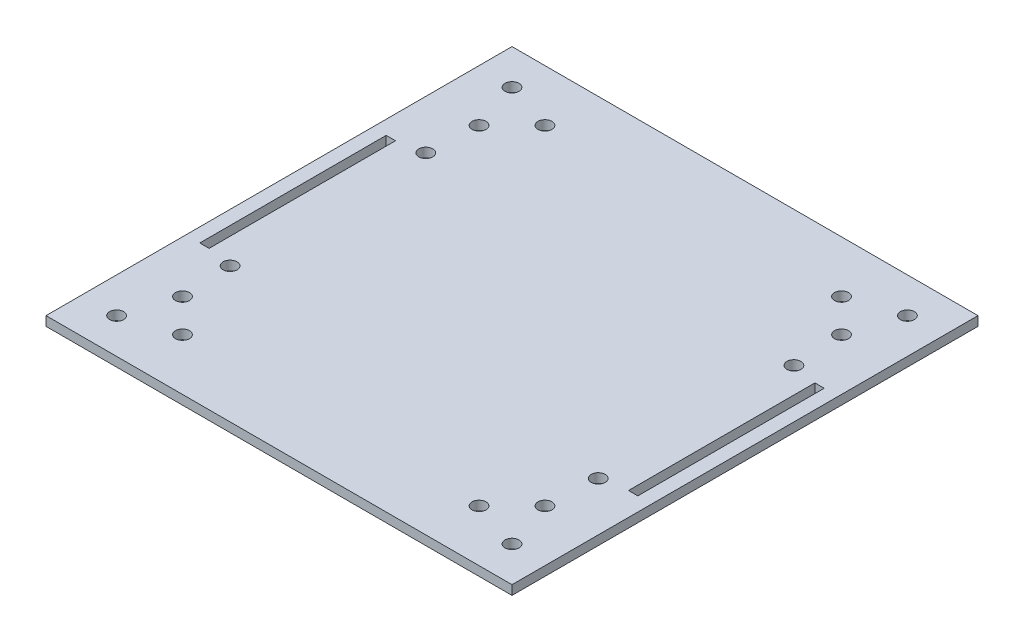
ISO-10303-21;
HEADER;
FILE_DESCRIPTION(('STEP AP214'),'2;1');
FILE_NAME('part.step','',(''),(''),'','','');
FILE_SCHEMA(('AUTOMOTIVE_DESIGN { 1 0 10303 214 1 1 1 1 }'));
ENDSEC;
DATA;
#1=APPLICATION_CONTEXT('core data for automotive mechanical design processes');
#2=APPLICATION_PROTOCOL_DEFINITION('international standard','automotive_design',2000,#1);
#3=PRODUCT_CONTEXT('',#1,'mechanical');
#4=PRODUCT('Part','Part','',(#3));
#5=PRODUCT_RELATED_PRODUCT_CATEGORY('part','',(#4));
#6=PRODUCT_DEFINITION_FORMATION('','',#4);
#7=PRODUCT_DEFINITION_CONTEXT('part definition',#1,'design');
#8=PRODUCT_DEFINITION('design','',#6,#7);
#9=PRODUCT_DEFINITION_SHAPE('','',#8);
#10=(LENGTH_UNIT() NAMED_UNIT(*) SI_UNIT(.MILLI.,.METRE.));
#11=(NAMED_UNIT(*) PLANE_ANGLE_UNIT() SI_UNIT($,.RADIAN.));
#12=(NAMED_UNIT(*) SI_UNIT($,.STERADIAN.) SOLID_ANGLE_UNIT());
#13=UNCERTAINTY_MEASURE_WITH_UNIT(LENGTH_MEASURE(1.E-05),#10,'distance_accuracy_value','');
#14=(GEOMETRIC_REPRESENTATION_CONTEXT(3) GLOBAL_UNCERTAINTY_ASSIGNED_CONTEXT((#13)) GLOBAL_UNIT_ASSIGNED_CONTEXT((#10,
#11,#12)) REPRESENTATION_CONTEXT('',''));
#15=CARTESIAN_POINT('',(0.,0.,0.));
#16=DIRECTION('',(0.,0.,1.));
#17=DIRECTION('',(1.,0.,0.));
#18=AXIS2_PLACEMENT_3D('',#15,#16,#17);
#19=CARTESIAN_POINT('',(50.,2.,50.));
#20=DIRECTION('',(-1.,0.,0.));
#21=DIRECTION('',(0.,0.,1.));
#22=AXIS2_PLACEMENT_3D('',#19,#20,#21);
#23=PLANE('',#22);
#24=DIRECTION('',(0.,0.,-1.));
#25=VECTOR('',#24,1.);
#26=CARTESIAN_POINT('',(50.,0.,50.));
#27=LINE('',#26,#25);
#28=CARTESIAN_POINT('',(50.,0.,50.));
#29=VERTEX_POINT('',#28);
#30=CARTESIAN_POINT('',(50.,0.,-50.));
#31=VERTEX_POINT('',#30);
#32=EDGE_CURVE('E290',#29,#31,#27,.T.);
#33=ORIENTED_EDGE('',*,*,#32,.T.);
#34=DIRECTION('',(0.,-1.,0.));
#35=VECTOR('',#34,1.);
#36=CARTESIAN_POINT('',(50.,2.,-50.));
#37=LINE('',#36,#35);
#38=CARTESIAN_POINT('',(50.,2.,-50.));
#39=VERTEX_POINT('',#38);
#40=EDGE_CURVE('E11',#39,#31,#37,.T.);
#41=ORIENTED_EDGE('',*,*,#40,.F.);
#42=DIRECTION('',(0.,0.,-1.));
#43=VECTOR('',#42,1.);
#44=CARTESIAN_POINT('',(50.,2.,50.));
#45=LINE('',#44,#43);
#46=CARTESIAN_POINT('',(50.,2.,50.));
#47=VERTEX_POINT('',#46);
#48=EDGE_CURVE('E293',#47,#39,#45,.T.);
#49=ORIENTED_EDGE('',*,*,#48,.F.);
#50=DIRECTION('',(0.,-1.,0.));
#51=VECTOR('',#50,1.);
#52=CARTESIAN_POINT('',(50.,2.,50.));
#53=LINE('',#52,#51);
#54=EDGE_CURVE('E303',#47,#29,#53,.T.);
#55=ORIENTED_EDGE('',*,*,#54,.T.);
#56=EDGE_LOOP('',(#33,#41,#49,#55));
#57=FACE_BOUND('',#56,.T.);
#58=ADVANCED_FACE('F38',(#57),#23,.F.);
#59=CARTESIAN_POINT('',(-50.,2.,-50.));
#60=DIRECTION('',(0.,0.,1.));
#61=DIRECTION('',(1.,0.,0.));
#62=AXIS2_PLACEMENT_3D('',#59,#60,#61);
#63=PLANE('',#62);
#64=DIRECTION('',(-1.,0.,0.));
#65=VECTOR('',#64,1.);
#66=CARTESIAN_POINT('',(-50.,0.,-50.));
#67=LINE('',#66,#65);
#68=CARTESIAN_POINT('',(-50.,0.,-50.));
#69=VERTEX_POINT('',#68);
#70=EDGE_CURVE('E306',#31,#69,#67,.T.);
#71=ORIENTED_EDGE('',*,*,#70,.T.);
#72=DIRECTION('',(0.,-1.,0.));
#73=VECTOR('',#72,1.);
#74=CARTESIAN_POINT('',(-50.,2.,-50.));
#75=LINE('',#74,#73);
#76=CARTESIAN_POINT('',(-50.,2.,-50.));
#77=VERTEX_POINT('',#76);
#78=EDGE_CURVE('E45',#77,#69,#75,.T.);
#79=ORIENTED_EDGE('',*,*,#78,.F.);
#80=DIRECTION('',(-1.,0.,0.));
#81=VECTOR('',#80,1.);
#82=CARTESIAN_POINT('',(-50.,2.,-50.));
#83=LINE('',#82,#81);
#84=EDGE_CURVE('E296',#39,#77,#83,.T.);
#85=ORIENTED_EDGE('',*,*,#84,.F.);
#86=ORIENTED_EDGE('',*,*,#40,.T.);
#87=EDGE_LOOP('',(#71,#79,#85,#86));
#88=FACE_BOUND('',#87,.T.);
#89=ADVANCED_FACE('F335',(#88),#63,.F.);
#90=CARTESIAN_POINT('',(-50.,2.,50.));
#91=DIRECTION('',(1.,0.,0.));
#92=DIRECTION('',(0.,0.,-1.));
#93=AXIS2_PLACEMENT_3D('',#90,#91,#92);
#94=PLANE('',#93);
#95=DIRECTION('',(0.,0.,1.));
#96=VECTOR('',#95,1.);
#97=CARTESIAN_POINT('',(-50.,0.,50.));
#98=LINE('',#97,#96);
#99=CARTESIAN_POINT('',(-50.,0.,50.));
#100=VERTEX_POINT('',#99);
#101=EDGE_CURVE('E308',#69,#100,#98,.T.);
#102=ORIENTED_EDGE('',*,*,#101,.T.);
#103=DIRECTION('',(0.,-1.,0.));
#104=VECTOR('',#103,1.);
#105=CARTESIAN_POINT('',(-50.,2.,50.));
#106=LINE('',#105,#104);
#107=CARTESIAN_POINT('',(-50.,2.,50.));
#108=VERTEX_POINT('',#107);
#109=EDGE_CURVE('E313',#108,#100,#106,.T.);
#110=ORIENTED_EDGE('',*,*,#109,.F.);
#111=DIRECTION('',(0.,0.,1.));
#112=VECTOR('',#111,1.);
#113=CARTESIAN_POINT('',(-50.,2.,50.));
#114=LINE('',#113,#112);
#115=EDGE_CURVE('E299',#77,#108,#114,.T.);
#116=ORIENTED_EDGE('',*,*,#115,.F.);
#117=ORIENTED_EDGE('',*,*,#78,.T.);
#118=EDGE_LOOP('',(#102,#110,#116,#117));
#119=FACE_BOUND('',#118,.T.);
#120=ADVANCED_FACE('F320',(#119),#94,.F.);
#121=CARTESIAN_POINT('',(-50.,2.,50.));
#122=DIRECTION('',(0.,0.,-1.));
#123=DIRECTION('',(-1.,0.,0.));
#124=AXIS2_PLACEMENT_3D('',#121,#122,#123);
#125=PLANE('',#124);
#126=DIRECTION('',(1.,0.,0.));
#127=VECTOR('',#126,1.);
#128=CARTESIAN_POINT('',(-50.,0.,50.));
#129=LINE('',#128,#127);
#130=EDGE_CURVE('E297',#100,#29,#129,.T.);
#131=ORIENTED_EDGE('',*,*,#130,.T.);
#132=ORIENTED_EDGE('',*,*,#54,.F.);
#133=DIRECTION('',(1.,0.,0.));
#134=VECTOR('',#133,1.);
#135=CARTESIAN_POINT('',(-50.,2.,50.));
#136=LINE('',#135,#134);
#137=EDGE_CURVE('E301',#108,#47,#136,.T.);
#138=ORIENTED_EDGE('',*,*,#137,.F.);
#139=ORIENTED_EDGE('',*,*,#109,.T.);
#140=EDGE_LOOP('',(#131,#132,#138,#139));
#141=FACE_BOUND('',#140,.T.);
#142=ADVANCED_FACE('F329',(#141),#125,.F.);
#143=CARTESIAN_POINT('',(0.,2.,0.));
#144=DIRECTION('',(0.,-1.,0.));
#145=DIRECTION('',(0.,0.,-1.));
#146=AXIS2_PLACEMENT_3D('',#143,#144,#145);
#147=PLANE('',#146);
#148=DIRECTION('',(1.,0.,0.));
#149=VECTOR('',#148,1.);
#150=CARTESIAN_POINT('',(-47.,2.,-20.));
#151=LINE('',#150,#149);
#152=CARTESIAN_POINT('',(-47.,2.,-20.));
#153=VERTEX_POINT('',#152);
#154=CARTESIAN_POINT('',(-45.,2.,-20.));
#155=VERTEX_POINT('',#154);
#156=EDGE_CURVE('E138',#153,#155,#151,.T.);
#157=ORIENTED_EDGE('',*,*,#156,.T.);
#158=DIRECTION('',(0.,0.,1.));
#159=VECTOR('',#158,1.);
#160=CARTESIAN_POINT('',(-45.,2.,-20.));
#161=LINE('',#160,#159);
#162=CARTESIAN_POINT('',(-45.,2.,20.));
#163=VERTEX_POINT('',#162);
#164=EDGE_CURVE('E130',#155,#163,#161,.T.);
#165=ORIENTED_EDGE('',*,*,#164,.T.);
#166=DIRECTION('',(-1.,0.,0.));
#167=VECTOR('',#166,1.);
#168=CARTESIAN_POINT('',(-47.,2.,20.));
#169=LINE('',#168,#167);
#170=CARTESIAN_POINT('',(-47.,2.,20.));
#171=VERTEX_POINT('',#170);
#172=EDGE_CURVE('E141',#163,#171,#169,.T.);
#173=ORIENTED_EDGE('',*,*,#172,.T.);
#174=DIRECTION('',(0.,0.,-1.));
#175=VECTOR('',#174,1.);
#176=CARTESIAN_POINT('',(-47.,2.,-20.));
#177=LINE('',#176,#175);
#178=EDGE_CURVE('E52',#171,#153,#177,.T.);
#179=ORIENTED_EDGE('',*,*,#178,.T.);
#180=EDGE_LOOP('',(#157,#165,#173,#179));
#181=FACE_BOUND('',#180,.T.);
#182=DIRECTION('',(1.,0.,0.));
#183=VECTOR('',#182,1.);
#184=CARTESIAN_POINT('',(47.,2.,-20.));
#185=LINE('',#184,#183);
#186=CARTESIAN_POINT('',(45.,2.,-20.));
#187=VERTEX_POINT('',#186);
#188=CARTESIAN_POINT('',(47.,2.,-20.));
#189=VERTEX_POINT('',#188);
#190=EDGE_CURVE('E176',#187,#189,#185,.T.);
#191=ORIENTED_EDGE('',*,*,#190,.T.);
#192=DIRECTION('',(0.,0.,1.));
#193=VECTOR('',#192,1.);
#194=CARTESIAN_POINT('',(47.,2.,-20.));
#195=LINE('',#194,#193);
#196=CARTESIAN_POINT('',(47.,2.,20.));
#197=VERTEX_POINT('',#196);
#198=EDGE_CURVE('E168',#189,#197,#195,.T.);
#199=ORIENTED_EDGE('',*,*,#198,.T.);
#200=DIRECTION('',(-1.,0.,0.));
#201=VECTOR('',#200,1.);
#202=CARTESIAN_POINT('',(47.,2.,20.));
#203=LINE('',#202,#201);
#204=CARTESIAN_POINT('',(45.,2.,20.));
#205=VERTEX_POINT('',#204);
#206=EDGE_CURVE('E171',#197,#205,#203,.T.);
#207=ORIENTED_EDGE('',*,*,#206,.T.);
#208=DIRECTION('',(0.,0.,-1.));
#209=VECTOR('',#208,1.);
#210=CARTESIAN_POINT('',(45.,2.,-20.));
#211=LINE('',#210,#209);
#212=EDGE_CURVE('E60',#205,#187,#211,.T.);
#213=ORIENTED_EDGE('',*,*,#212,.T.);
#214=EDGE_LOOP('',(#191,#199,#207,#213));
#215=FACE_BOUND('',#214,.T.);
#216=CARTESIAN_POINT('',(-39.5,2.,-21.));
#217=DIRECTION('',(0.,-1.,0.));
#218=DIRECTION('',(0.,0.,1.));
#219=AXIS2_PLACEMENT_3D('',#216,#217,#218);
#220=CIRCLE('',#219,1.5);
#221=CARTESIAN_POINT('',(-39.5,2.,-19.5));
#222=VERTEX_POINT('',#221);
#223=EDGE_CURVE('E210',#222,#222,#220,.T.);
#224=ORIENTED_EDGE('',*,*,#223,.T.);
#225=EDGE_LOOP('',(#224));
#226=FACE_BOUND('',#225,.T.);
#227=CARTESIAN_POINT('',(39.5,2.,-21.));
#228=DIRECTION('',(0.,-1.,0.));
#229=DIRECTION('',(0.,0.,-1.));
#230=AXIS2_PLACEMENT_3D('',#227,#228,#229);
#231=CIRCLE('',#230,1.5);
#232=CARTESIAN_POINT('',(39.5,2.,-22.5));
#233=VERTEX_POINT('',#232);
#234=EDGE_CURVE('E204',#233,#233,#231,.T.);
#235=ORIENTED_EDGE('',*,*,#234,.T.);
#236=EDGE_LOOP('',(#235));
#237=FACE_BOUND('',#236,.T.);
#238=CARTESIAN_POINT('',(39.5,2.,21.));
#239=DIRECTION('',(0.,-1.,0.));
#240=DIRECTION('',(0.,0.,1.));
#241=AXIS2_PLACEMENT_3D('',#238,#239,#240);
#242=CIRCLE('',#241,1.5);
#243=CARTESIAN_POINT('',(39.5,2.,22.5));
#244=VERTEX_POINT('',#243);
#245=EDGE_CURVE('E197',#244,#244,#242,.T.);
#246=ORIENTED_EDGE('',*,*,#245,.T.);
#247=EDGE_LOOP('',(#246));
#248=FACE_BOUND('',#247,.T.);
#249=CARTESIAN_POINT('',(-39.5,2.,21.));
#250=DIRECTION('',(0.,-1.,0.));
#251=DIRECTION('',(0.,0.,-1.));
#252=AXIS2_PLACEMENT_3D('',#249,#250,#251);
#253=CIRCLE('',#252,1.5);
#254=CARTESIAN_POINT('',(-39.5,2.,19.5));
#255=VERTEX_POINT('',#254);
#256=EDGE_CURVE('E215',#255,#255,#253,.T.);
#257=ORIENTED_EDGE('',*,*,#256,.T.);
#258=EDGE_LOOP('',(#257));
#259=FACE_BOUND('',#258,.T.);
#260=CARTESIAN_POINT('',(42.4264068711928,2.,-42.4264068711929));
#261=DIRECTION('',(0.,1.,0.));
#262=DIRECTION('',(0.,0.,-1.));
#263=AXIS2_PLACEMENT_3D('',#260,#261,#262);
#264=CIRCLE('',#263,1.5);
#265=CARTESIAN_POINT('',(42.4264068711928,2.,-43.9264068711929));
#266=VERTEX_POINT('',#265);
#267=EDGE_CURVE('E224',#266,#266,#264,.T.);
#268=ORIENTED_EDGE('',*,*,#267,.F.);
#269=EDGE_LOOP('',(#268));
#270=FACE_BOUND('',#269,.T.);
#271=CARTESIAN_POINT('',(38.89087296526,2.,-31.8198051533947));
#272=DIRECTION('',(0.,1.,0.));
#273=DIRECTION('',(0.,0.,-1.));
#274=AXIS2_PLACEMENT_3D('',#271,#272,#273);
#275=CIRCLE('',#274,1.5);
#276=CARTESIAN_POINT('',(38.89087296526,2.,-33.3198051533947));
#277=VERTEX_POINT('',#276);
#278=EDGE_CURVE('E255',#277,#277,#275,.T.);
#279=ORIENTED_EDGE('',*,*,#278,.F.);
#280=EDGE_LOOP('',(#279));
#281=FACE_BOUND('',#280,.T.);
#282=CARTESIAN_POINT('',(31.8198051533946,2.,-38.8908729652602));
#283=DIRECTION('',(0.,1.,0.));
#284=DIRECTION('',(0.,0.,-1.));
#285=AXIS2_PLACEMENT_3D('',#282,#283,#284);
#286=CIRCLE('',#285,1.5);
#287=CARTESIAN_POINT('',(31.8198051533946,2.,-40.3908729652602));
#288=VERTEX_POINT('',#287);
#289=EDGE_CURVE('E249',#288,#288,#286,.T.);
#290=ORIENTED_EDGE('',*,*,#289,.F.);
#291=EDGE_LOOP('',(#290));
#292=FACE_BOUND('',#291,.T.);
#293=CARTESIAN_POINT('',(-42.4264068711928,2.,42.4264068711929));
#294=DIRECTION('',(0.,1.,0.));
#295=DIRECTION('',(0.,0.,-1.));
#296=AXIS2_PLACEMENT_3D('',#293,#294,#295);
#297=CIRCLE('',#296,1.5);
#298=CARTESIAN_POINT('',(-42.4264068711928,2.,40.9264068711929));
#299=VERTEX_POINT('',#298);
#300=EDGE_CURVE('E243',#299,#299,#297,.T.);
#301=ORIENTED_EDGE('',*,*,#300,.F.);
#302=EDGE_LOOP('',(#301));
#303=FACE_BOUND('',#302,.T.);
#304=CARTESIAN_POINT('',(-38.89087296526,2.,31.8198051533947));
#305=DIRECTION('',(0.,1.,0.));
#306=DIRECTION('',(0.,0.,-1.));
#307=AXIS2_PLACEMENT_3D('',#304,#305,#306);
#308=CIRCLE('',#307,1.5);
#309=CARTESIAN_POINT('',(-38.89087296526,2.,30.3198051533947));
#310=VERTEX_POINT('',#309);
#311=EDGE_CURVE('E242',#310,#310,#308,.T.);
#312=ORIENTED_EDGE('',*,*,#311,.F.);
#313=EDGE_LOOP('',(#312));
#314=FACE_BOUND('',#313,.T.);
#315=CARTESIAN_POINT('',(-31.8198051533946,2.,38.8908729652602));
#316=DIRECTION('',(0.,1.,0.));
#317=DIRECTION('',(0.,0.,-1.));
#318=AXIS2_PLACEMENT_3D('',#315,#316,#317);
#319=CIRCLE('',#318,1.5);
#320=CARTESIAN_POINT('',(-31.8198051533946,2.,37.3908729652602));
#321=VERTEX_POINT('',#320);
#322=EDGE_CURVE('E279',#321,#321,#319,.T.);
#323=ORIENTED_EDGE('',*,*,#322,.F.);
#324=EDGE_LOOP('',(#323));
#325=FACE_BOUND('',#324,.T.);
#326=CARTESIAN_POINT('',(-38.89087296526,2.,-31.8198051533947));
#327=DIRECTION('',(0.,1.,0.));
#328=DIRECTION('',(0.,0.,1.));
#329=AXIS2_PLACEMENT_3D('',#326,#327,#328);
#330=CIRCLE('',#329,1.5);
#331=CARTESIAN_POINT('',(-38.89087296526,2.,-30.3198051533947));
#332=VERTEX_POINT('',#331);
#333=EDGE_CURVE('E273',#332,#332,#330,.T.);
#334=ORIENTED_EDGE('',*,*,#333,.F.);
#335=EDGE_LOOP('',(#334));
#336=FACE_BOUND('',#335,.T.);
#337=CARTESIAN_POINT('',(-31.8198051533946,2.,-38.8908729652602));
#338=DIRECTION('',(0.,1.,0.));
#339=DIRECTION('',(0.,0.,1.));
#340=AXIS2_PLACEMENT_3D('',#337,#338,#339);
#341=CIRCLE('',#340,1.5);
#342=CARTESIAN_POINT('',(-31.8198051533946,2.,-37.3908729652602));
#343=VERTEX_POINT('',#342);
#344=EDGE_CURVE('E267',#343,#343,#341,.T.);
#345=ORIENTED_EDGE('',*,*,#344,.F.);
#346=EDGE_LOOP('',(#345));
#347=FACE_BOUND('',#346,.T.);
#348=CARTESIAN_POINT('',(31.8198051533946,2.,38.8908729652602));
#349=DIRECTION('',(0.,1.,0.));
#350=DIRECTION('',(0.,0.,1.));
#351=AXIS2_PLACEMENT_3D('',#348,#349,#350);
#352=CIRCLE('',#351,1.5);
#353=CARTESIAN_POINT('',(31.8198051533946,2.,40.3908729652602));
#354=VERTEX_POINT('',#353);
#355=EDGE_CURVE('E225',#354,#354,#352,.T.);
#356=ORIENTED_EDGE('',*,*,#355,.F.);
#357=EDGE_LOOP('',(#356));
#358=FACE_BOUND('',#357,.T.);
#359=CARTESIAN_POINT('',(42.4264068711928,2.,42.4264068711929));
#360=DIRECTION('',(0.,1.,0.));
#361=DIRECTION('',(0.,0.,1.));
#362=AXIS2_PLACEMENT_3D('',#359,#360,#361);
#363=CIRCLE('',#362,1.49999999999998);
#364=CARTESIAN_POINT('',(42.4264068711928,2.,43.9264068711929));
#365=VERTEX_POINT('',#364);
#366=EDGE_CURVE('E231',#365,#365,#363,.T.);
#367=ORIENTED_EDGE('',*,*,#366,.F.);
#368=EDGE_LOOP('',(#367));
#369=FACE_BOUND('',#368,.T.);
#370=CARTESIAN_POINT('',(38.89087296526,2.,31.8198051533947));
#371=DIRECTION('',(0.,1.,0.));
#372=DIRECTION('',(0.,0.,1.));
#373=AXIS2_PLACEMENT_3D('',#370,#371,#372);
#374=CIRCLE('',#373,1.5);
#375=CARTESIAN_POINT('',(38.89087296526,2.,33.3198051533947));
#376=VERTEX_POINT('',#375);
#377=EDGE_CURVE('E218',#376,#376,#374,.T.);
#378=ORIENTED_EDGE('',*,*,#377,.F.);
#379=EDGE_LOOP('',(#378));
#380=FACE_BOUND('',#379,.T.);
#381=CARTESIAN_POINT('',(-42.4264068711928,2.,-42.4264068711929));
#382=DIRECTION('',(0.,1.,0.));
#383=DIRECTION('',(0.,0.,1.));
#384=AXIS2_PLACEMENT_3D('',#381,#382,#383);
#385=CIRCLE('',#384,1.5);
#386=CARTESIAN_POINT('',(-42.4264068711928,2.,-40.9264068711929));
#387=VERTEX_POINT('',#386);
#388=EDGE_CURVE('E266',#387,#387,#385,.T.);
#389=ORIENTED_EDGE('',*,*,#388,.F.);
#390=EDGE_LOOP('',(#389));
#391=FACE_BOUND('',#390,.T.);
#392=ORIENTED_EDGE('',*,*,#48,.T.);
#393=ORIENTED_EDGE('',*,*,#84,.T.);
#394=ORIENTED_EDGE('',*,*,#115,.T.);
#395=ORIENTED_EDGE('',*,*,#137,.T.);
#396=EDGE_LOOP('',(#392,#393,#394,#395));
#397=FACE_BOUND('',#396,.T.);
#398=ADVANCED_FACE('F145',(#181,#215,#226,#237,#248,#259,#270,#281,#292,#303,#314,#325,#336,
#347,#358,#369,#380,#391,#397),#147,.F.);
#399=CARTESIAN_POINT('',(0.,0.,0.));
#400=DIRECTION('',(0.,-1.,0.));
#401=DIRECTION('',(0.,0.,-1.));
#402=AXIS2_PLACEMENT_3D('',#399,#400,#401);
#403=PLANE('',#402);
#404=DIRECTION('',(0.,0.,1.));
#405=VECTOR('',#404,1.);
#406=CARTESIAN_POINT('',(-45.,0.,-20.));
#407=LINE('',#406,#405);
#408=CARTESIAN_POINT('',(-45.,0.,-20.));
#409=VERTEX_POINT('',#408);
#410=CARTESIAN_POINT('',(-45.,0.,20.));
#411=VERTEX_POINT('',#410);
#412=EDGE_CURVE('E133',#409,#411,#407,.T.);
#413=ORIENTED_EDGE('',*,*,#412,.F.);
#414=DIRECTION('',(1.,0.,0.));
#415=VECTOR('',#414,1.);
#416=CARTESIAN_POINT('',(-47.,0.,-20.));
#417=LINE('',#416,#415);
#418=CARTESIAN_POINT('',(-47.,0.,-20.));
#419=VERTEX_POINT('',#418);
#420=EDGE_CURVE('E148',#419,#409,#417,.T.);
#421=ORIENTED_EDGE('',*,*,#420,.F.);
#422=DIRECTION('',(0.,0.,-1.));
#423=VECTOR('',#422,1.);
#424=CARTESIAN_POINT('',(-47.,0.,-20.));
#425=LINE('',#424,#423);
#426=CARTESIAN_POINT('',(-47.,0.,20.));
#427=VERTEX_POINT('',#426);
#428=EDGE_CURVE('E151',#427,#419,#425,.T.);
#429=ORIENTED_EDGE('',*,*,#428,.F.);
#430=DIRECTION('',(-1.,0.,0.));
#431=VECTOR('',#430,1.);
#432=CARTESIAN_POINT('',(-47.,0.,20.));
#433=LINE('',#432,#431);
#434=EDGE_CURVE('E157',#411,#427,#433,.T.);
#435=ORIENTED_EDGE('',*,*,#434,.F.);
#436=EDGE_LOOP('',(#413,#421,#429,#435));
#437=FACE_BOUND('',#436,.T.);
#438=DIRECTION('',(0.,0.,1.));
#439=VECTOR('',#438,1.);
#440=CARTESIAN_POINT('',(47.,0.,-20.));
#441=LINE('',#440,#439);
#442=CARTESIAN_POINT('',(47.,0.,-20.));
#443=VERTEX_POINT('',#442);
#444=CARTESIAN_POINT('',(47.,0.,20.));
#445=VERTEX_POINT('',#444);
#446=EDGE_CURVE('E180',#443,#445,#441,.T.);
#447=ORIENTED_EDGE('',*,*,#446,.F.);
#448=DIRECTION('',(1.,0.,0.));
#449=VECTOR('',#448,1.);
#450=CARTESIAN_POINT('',(47.,0.,-20.));
#451=LINE('',#450,#449);
#452=CARTESIAN_POINT('',(45.,0.,-20.));
#453=VERTEX_POINT('',#452);
#454=EDGE_CURVE('E172',#453,#443,#451,.T.);
#455=ORIENTED_EDGE('',*,*,#454,.F.);
#456=DIRECTION('',(0.,0.,-1.));
#457=VECTOR('',#456,1.);
#458=CARTESIAN_POINT('',(45.,0.,-20.));
#459=LINE('',#458,#457);
#460=CARTESIAN_POINT('',(45.,0.,20.));
#461=VERTEX_POINT('',#460);
#462=EDGE_CURVE('E185',#461,#453,#459,.T.);
#463=ORIENTED_EDGE('',*,*,#462,.F.);
#464=DIRECTION('',(-1.,0.,0.));
#465=VECTOR('',#464,1.);
#466=CARTESIAN_POINT('',(47.,0.,20.));
#467=LINE('',#466,#465);
#468=EDGE_CURVE('E182',#445,#461,#467,.T.);
#469=ORIENTED_EDGE('',*,*,#468,.F.);
#470=EDGE_LOOP('',(#447,#455,#463,#469));
#471=FACE_BOUND('',#470,.T.);
#472=CARTESIAN_POINT('',(-39.5,0.,-21.));
#473=DIRECTION('',(0.,-1.,0.));
#474=DIRECTION('',(0.,0.,1.));
#475=AXIS2_PLACEMENT_3D('',#472,#473,#474);
#476=CIRCLE('',#475,1.5);
#477=CARTESIAN_POINT('',(-39.5,0.,-19.5));
#478=VERTEX_POINT('',#477);
#479=EDGE_CURVE('E164',#478,#478,#476,.T.);
#480=ORIENTED_EDGE('',*,*,#479,.F.);
#481=EDGE_LOOP('',(#480));
#482=FACE_BOUND('',#481,.T.);
#483=CARTESIAN_POINT('',(39.5,0.,-21.));
#484=DIRECTION('',(0.,-1.,0.));
#485=DIRECTION('',(0.,0.,-1.));
#486=AXIS2_PLACEMENT_3D('',#483,#484,#485);
#487=CIRCLE('',#486,1.5);
#488=CARTESIAN_POINT('',(39.5,0.,-22.5));
#489=VERTEX_POINT('',#488);
#490=EDGE_CURVE('E207',#489,#489,#487,.T.);
#491=ORIENTED_EDGE('',*,*,#490,.F.);
#492=EDGE_LOOP('',(#491));
#493=FACE_BOUND('',#492,.T.);
#494=CARTESIAN_POINT('',(39.5,0.,21.));
#495=DIRECTION('',(0.,-1.,0.));
#496=DIRECTION('',(0.,0.,1.));
#497=AXIS2_PLACEMENT_3D('',#494,#495,#496);
#498=CIRCLE('',#497,1.5);
#499=CARTESIAN_POINT('',(39.5,0.,22.5));
#500=VERTEX_POINT('',#499);
#501=EDGE_CURVE('E201',#500,#500,#498,.T.);
#502=ORIENTED_EDGE('',*,*,#501,.F.);
#503=EDGE_LOOP('',(#502));
#504=FACE_BOUND('',#503,.T.);
#505=CARTESIAN_POINT('',(-39.5,0.,21.));
#506=DIRECTION('',(0.,-1.,0.));
#507=DIRECTION('',(0.,0.,-1.));
#508=AXIS2_PLACEMENT_3D('',#505,#506,#507);
#509=CIRCLE('',#508,1.5);
#510=CARTESIAN_POINT('',(-39.5,0.,19.5));
#511=VERTEX_POINT('',#510);
#512=EDGE_CURVE('E200',#511,#511,#509,.T.);
#513=ORIENTED_EDGE('',*,*,#512,.F.);
#514=EDGE_LOOP('',(#513));
#515=FACE_BOUND('',#514,.T.);
#516=CARTESIAN_POINT('',(42.4264068711928,0.,-42.4264068711929));
#517=DIRECTION('',(0.,1.,0.));
#518=DIRECTION('',(0.,0.,-1.));
#519=AXIS2_PLACEMENT_3D('',#516,#517,#518);
#520=CIRCLE('',#519,1.5);
#521=CARTESIAN_POINT('',(42.4264068711928,0.,-43.9264068711929));
#522=VERTEX_POINT('',#521);
#523=EDGE_CURVE('E258',#522,#522,#520,.T.);
#524=ORIENTED_EDGE('',*,*,#523,.T.);
#525=EDGE_LOOP('',(#524));
#526=FACE_BOUND('',#525,.T.);
#527=CARTESIAN_POINT('',(38.89087296526,0.,-31.8198051533947));
#528=DIRECTION('',(0.,1.,0.));
#529=DIRECTION('',(0.,0.,-1.));
#530=AXIS2_PLACEMENT_3D('',#527,#528,#529);
#531=CIRCLE('',#530,1.5);
#532=CARTESIAN_POINT('',(38.89087296526,0.,-33.3198051533947));
#533=VERTEX_POINT('',#532);
#534=EDGE_CURVE('E252',#533,#533,#531,.T.);
#535=ORIENTED_EDGE('',*,*,#534,.T.);
#536=EDGE_LOOP('',(#535));
#537=FACE_BOUND('',#536,.T.);
#538=CARTESIAN_POINT('',(31.8198051533946,0.,-38.8908729652602));
#539=DIRECTION('',(0.,1.,0.));
#540=DIRECTION('',(0.,0.,-1.));
#541=AXIS2_PLACEMENT_3D('',#538,#539,#540);
#542=CIRCLE('',#541,1.5);
#543=CARTESIAN_POINT('',(31.8198051533946,0.,-40.3908729652602));
#544=VERTEX_POINT('',#543);
#545=EDGE_CURVE('E246',#544,#544,#542,.T.);
#546=ORIENTED_EDGE('',*,*,#545,.T.);
#547=EDGE_LOOP('',(#546));
#548=FACE_BOUND('',#547,.T.);
#549=CARTESIAN_POINT('',(-42.4264068711928,0.,42.4264068711929));
#550=DIRECTION('',(0.,1.,0.));
#551=DIRECTION('',(0.,0.,-1.));
#552=AXIS2_PLACEMENT_3D('',#549,#550,#551);
#553=CIRCLE('',#552,1.5);
#554=CARTESIAN_POINT('',(-42.4264068711928,0.,40.9264068711929));
#555=VERTEX_POINT('',#554);
#556=EDGE_CURVE('E239',#555,#555,#553,.T.);
#557=ORIENTED_EDGE('',*,*,#556,.T.);
#558=EDGE_LOOP('',(#557));
#559=FACE_BOUND('',#558,.T.);
#560=CARTESIAN_POINT('',(-38.89087296526,0.,31.8198051533947));
#561=DIRECTION('',(0.,1.,0.));
#562=DIRECTION('',(0.,0.,-1.));
#563=AXIS2_PLACEMENT_3D('',#560,#561,#562);
#564=CIRCLE('',#563,1.5);
#565=CARTESIAN_POINT('',(-38.89087296526,0.,30.3198051533947));
#566=VERTEX_POINT('',#565);
#567=EDGE_CURVE('E282',#566,#566,#564,.T.);
#568=ORIENTED_EDGE('',*,*,#567,.T.);
#569=EDGE_LOOP('',(#568));
#570=FACE_BOUND('',#569,.T.);
#571=CARTESIAN_POINT('',(-31.8198051533946,0.,38.8908729652602));
#572=DIRECTION('',(0.,1.,0.));
#573=DIRECTION('',(0.,0.,-1.));
#574=AXIS2_PLACEMENT_3D('',#571,#572,#573);
#575=CIRCLE('',#574,1.5);
#576=CARTESIAN_POINT('',(-31.8198051533946,0.,37.3908729652602));
#577=VERTEX_POINT('',#576);
#578=EDGE_CURVE('E276',#577,#577,#575,.T.);
#579=ORIENTED_EDGE('',*,*,#578,.T.);
#580=EDGE_LOOP('',(#579));
#581=FACE_BOUND('',#580,.T.);
#582=CARTESIAN_POINT('',(-38.89087296526,0.,-31.8198051533947));
#583=DIRECTION('',(0.,1.,0.));
#584=DIRECTION('',(0.,0.,1.));
#585=AXIS2_PLACEMENT_3D('',#582,#583,#584);
#586=CIRCLE('',#585,1.5);
#587=CARTESIAN_POINT('',(-38.89087296526,0.,-30.3198051533947));
#588=VERTEX_POINT('',#587);
#589=EDGE_CURVE('E270',#588,#588,#586,.T.);
#590=ORIENTED_EDGE('',*,*,#589,.T.);
#591=EDGE_LOOP('',(#590));
#592=FACE_BOUND('',#591,.T.);
#593=CARTESIAN_POINT('',(-31.8198051533946,0.,-38.8908729652602));
#594=DIRECTION('',(0.,1.,0.));
#595=DIRECTION('',(0.,0.,1.));
#596=AXIS2_PLACEMENT_3D('',#593,#594,#595);
#597=CIRCLE('',#596,1.5);
#598=CARTESIAN_POINT('',(-31.8198051533946,0.,-37.3908729652602));
#599=VERTEX_POINT('',#598);
#600=EDGE_CURVE('E263',#599,#599,#597,.T.);
#601=ORIENTED_EDGE('',*,*,#600,.T.);
#602=EDGE_LOOP('',(#601));
#603=FACE_BOUND('',#602,.T.);
#604=CARTESIAN_POINT('',(31.8198051533946,0.,38.8908729652602));
#605=DIRECTION('',(0.,1.,0.));
#606=DIRECTION('',(0.,0.,1.));
#607=AXIS2_PLACEMENT_3D('',#604,#605,#606);
#608=CIRCLE('',#607,1.5);
#609=CARTESIAN_POINT('',(31.8198051533946,0.,40.3908729652602));
#610=VERTEX_POINT('',#609);
#611=EDGE_CURVE('E221',#610,#610,#608,.T.);
#612=ORIENTED_EDGE('',*,*,#611,.T.);
#613=EDGE_LOOP('',(#612));
#614=FACE_BOUND('',#613,.T.);
#615=CARTESIAN_POINT('',(42.4264068711928,0.,42.4264068711929));
#616=DIRECTION('',(0.,1.,0.));
#617=DIRECTION('',(0.,0.,1.));
#618=AXIS2_PLACEMENT_3D('',#615,#616,#617);
#619=CIRCLE('',#618,1.49999999999998);
#620=CARTESIAN_POINT('',(42.4264068711928,0.,43.9264068711929));
#621=VERTEX_POINT('',#620);
#622=EDGE_CURVE('E228',#621,#621,#619,.T.);
#623=ORIENTED_EDGE('',*,*,#622,.T.);
#624=EDGE_LOOP('',(#623));
#625=FACE_BOUND('',#624,.T.);
#626=CARTESIAN_POINT('',(38.89087296526,0.,31.8198051533947));
#627=DIRECTION('',(0.,1.,0.));
#628=DIRECTION('',(0.,0.,1.));
#629=AXIS2_PLACEMENT_3D('',#626,#627,#628);
#630=CIRCLE('',#629,1.5);
#631=CARTESIAN_POINT('',(38.89087296526,0.,33.3198051533947));
#632=VERTEX_POINT('',#631);
#633=EDGE_CURVE('E234',#632,#632,#630,.T.);
#634=ORIENTED_EDGE('',*,*,#633,.T.);
#635=EDGE_LOOP('',(#634));
#636=FACE_BOUND('',#635,.T.);
#637=CARTESIAN_POINT('',(-42.4264068711928,0.,-42.4264068711929));
#638=DIRECTION('',(0.,1.,0.));
#639=DIRECTION('',(0.,0.,1.));
#640=AXIS2_PLACEMENT_3D('',#637,#638,#639);
#641=CIRCLE('',#640,1.5);
#642=CARTESIAN_POINT('',(-42.4264068711928,0.,-40.9264068711929));
#643=VERTEX_POINT('',#642);
#644=EDGE_CURVE('E287',#643,#643,#641,.T.);
#645=ORIENTED_EDGE('',*,*,#644,.T.);
#646=EDGE_LOOP('',(#645));
#647=FACE_BOUND('',#646,.T.);
#648=ORIENTED_EDGE('',*,*,#32,.F.);
#649=ORIENTED_EDGE('',*,*,#130,.F.);
#650=ORIENTED_EDGE('',*,*,#101,.F.);
#651=ORIENTED_EDGE('',*,*,#70,.F.);
#652=EDGE_LOOP('',(#648,#649,#650,#651));
#653=FACE_BOUND('',#652,.T.);
#654=ADVANCED_FACE('F326',(#437,#471,#482,#493,#504,#515,#526,#537,#548,#559,#570,#581,#592,
#603,#614,#625,#636,#647,#653),#403,.T.);
#655=CARTESIAN_POINT('',(-42.4264068711928,0.,-42.4264068711929));
#656=DIRECTION('',(0.,1.,0.));
#657=DIRECTION('',(0.,0.,1.));
#658=AXIS2_PLACEMENT_3D('',#655,#656,#657);
#659=CYLINDRICAL_SURFACE('',#658,1.5);
#660=ORIENTED_EDGE('',*,*,#644,.F.);
#661=EDGE_LOOP('',(#660));
#662=FACE_BOUND('',#661,.T.);
#663=ORIENTED_EDGE('',*,*,#388,.T.);
#664=EDGE_LOOP('',(#663));
#665=FACE_BOUND('',#664,.T.);
#666=ADVANCED_FACE('F347',(#662,#665),#659,.F.);
#667=CARTESIAN_POINT('',(38.89087296526,0.,31.8198051533947));
#668=DIRECTION('',(0.,1.,0.));
#669=DIRECTION('',(0.,0.,1.));
#670=AXIS2_PLACEMENT_3D('',#667,#668,#669);
#671=CYLINDRICAL_SURFACE('',#670,1.5);
#672=ORIENTED_EDGE('',*,*,#633,.F.);
#673=EDGE_LOOP('',(#672));
#674=FACE_BOUND('',#673,.T.);
#675=ORIENTED_EDGE('',*,*,#377,.T.);
#676=EDGE_LOOP('',(#675));
#677=FACE_BOUND('',#676,.T.);
#678=ADVANCED_FACE('F353',(#674,#677),#671,.F.);
#679=CARTESIAN_POINT('',(42.4264068711928,0.,42.4264068711929));
#680=DIRECTION('',(0.,1.,0.));
#681=DIRECTION('',(0.,0.,1.));
#682=AXIS2_PLACEMENT_3D('',#679,#680,#681);
#683=CYLINDRICAL_SURFACE('',#682,1.49999999999998);
#684=ORIENTED_EDGE('',*,*,#622,.F.);
#685=EDGE_LOOP('',(#684));
#686=FACE_BOUND('',#685,.T.);
#687=ORIENTED_EDGE('',*,*,#366,.T.);
#688=EDGE_LOOP('',(#687));
#689=FACE_BOUND('',#688,.T.);
#690=ADVANCED_FACE('F391',(#686,#689),#683,.F.);
#691=CARTESIAN_POINT('',(31.8198051533946,0.,38.8908729652602));
#692=DIRECTION('',(0.,1.,0.));
#693=DIRECTION('',(0.,0.,1.));
#694=AXIS2_PLACEMENT_3D('',#691,#692,#693);
#695=CYLINDRICAL_SURFACE('',#694,1.5);
#696=ORIENTED_EDGE('',*,*,#611,.F.);
#697=EDGE_LOOP('',(#696));
#698=FACE_BOUND('',#697,.T.);
#699=ORIENTED_EDGE('',*,*,#355,.T.);
#700=EDGE_LOOP('',(#699));
#701=FACE_BOUND('',#700,.T.);
#702=ADVANCED_FACE('F371',(#698,#701),#695,.F.);
#703=CARTESIAN_POINT('',(-31.8198051533946,0.,-38.8908729652602));
#704=DIRECTION('',(0.,1.,0.));
#705=DIRECTION('',(0.,0.,1.));
#706=AXIS2_PLACEMENT_3D('',#703,#704,#705);
#707=CYLINDRICAL_SURFACE('',#706,1.5);
#708=ORIENTED_EDGE('',*,*,#600,.F.);
#709=EDGE_LOOP('',(#708));
#710=FACE_BOUND('',#709,.T.);
#711=ORIENTED_EDGE('',*,*,#344,.T.);
#712=EDGE_LOOP('',(#711));
#713=FACE_BOUND('',#712,.T.);
#714=ADVANCED_FACE('F367',(#710,#713),#707,.F.);
#715=CARTESIAN_POINT('',(-38.89087296526,0.,-31.8198051533947));
#716=DIRECTION('',(0.,1.,0.));
#717=DIRECTION('',(0.,0.,1.));
#718=AXIS2_PLACEMENT_3D('',#715,#716,#717);
#719=CYLINDRICAL_SURFACE('',#718,1.5);
#720=ORIENTED_EDGE('',*,*,#589,.F.);
#721=EDGE_LOOP('',(#720));
#722=FACE_BOUND('',#721,.T.);
#723=ORIENTED_EDGE('',*,*,#333,.T.);
#724=EDGE_LOOP('',(#723));
#725=FACE_BOUND('',#724,.T.);
#726=ADVANCED_FACE('F363',(#722,#725),#719,.F.);
#727=CARTESIAN_POINT('',(-31.8198051533946,0.,38.8908729652602));
#728=DIRECTION('',(0.,1.,0.));
#729=DIRECTION('',(0.,0.,1.));
#730=AXIS2_PLACEMENT_3D('',#727,#728,#729);
#731=CYLINDRICAL_SURFACE('',#730,1.5);
#732=ORIENTED_EDGE('',*,*,#578,.F.);
#733=EDGE_LOOP('',(#732));
#734=FACE_BOUND('',#733,.T.);
#735=ORIENTED_EDGE('',*,*,#322,.T.);
#736=EDGE_LOOP('',(#735));
#737=FACE_BOUND('',#736,.T.);
#738=ADVANCED_FACE('F359',(#734,#737),#731,.F.);
#739=CARTESIAN_POINT('',(-38.89087296526,0.,31.8198051533947));
#740=DIRECTION('',(0.,1.,0.));
#741=DIRECTION('',(0.,0.,1.));
#742=AXIS2_PLACEMENT_3D('',#739,#740,#741);
#743=CYLINDRICAL_SURFACE('',#742,1.5);
#744=ORIENTED_EDGE('',*,*,#567,.F.);
#745=EDGE_LOOP('',(#744));
#746=FACE_BOUND('',#745,.T.);
#747=ORIENTED_EDGE('',*,*,#311,.T.);
#748=EDGE_LOOP('',(#747));
#749=FACE_BOUND('',#748,.T.);
#750=ADVANCED_FACE('F355',(#746,#749),#743,.F.);
#751=CARTESIAN_POINT('',(-42.4264068711928,0.,42.4264068711929));
#752=DIRECTION('',(0.,1.,0.));
#753=DIRECTION('',(0.,0.,1.));
#754=AXIS2_PLACEMENT_3D('',#751,#752,#753);
#755=CYLINDRICAL_SURFACE('',#754,1.5);
#756=ORIENTED_EDGE('',*,*,#556,.F.);
#757=EDGE_LOOP('',(#756));
#758=FACE_BOUND('',#757,.T.);
#759=ORIENTED_EDGE('',*,*,#300,.T.);
#760=EDGE_LOOP('',(#759));
#761=FACE_BOUND('',#760,.T.);
#762=ADVANCED_FACE('F358',(#758,#761),#755,.F.);
#763=CARTESIAN_POINT('',(31.8198051533946,0.,-38.8908729652602));
#764=DIRECTION('',(0.,1.,0.));
#765=DIRECTION('',(0.,0.,1.));
#766=AXIS2_PLACEMENT_3D('',#763,#764,#765);
#767=CYLINDRICAL_SURFACE('',#766,1.5);
#768=ORIENTED_EDGE('',*,*,#545,.F.);
#769=EDGE_LOOP('',(#768));
#770=FACE_BOUND('',#769,.T.);
#771=ORIENTED_EDGE('',*,*,#289,.T.);
#772=EDGE_LOOP('',(#771));
#773=FACE_BOUND('',#772,.T.);
#774=ADVANCED_FACE('F381',(#770,#773),#767,.F.);
#775=CARTESIAN_POINT('',(38.89087296526,0.,-31.8198051533947));
#776=DIRECTION('',(0.,1.,0.));
#777=DIRECTION('',(0.,0.,1.));
#778=AXIS2_PLACEMENT_3D('',#775,#776,#777);
#779=CYLINDRICAL_SURFACE('',#778,1.5);
#780=ORIENTED_EDGE('',*,*,#534,.F.);
#781=EDGE_LOOP('',(#780));
#782=FACE_BOUND('',#781,.T.);
#783=ORIENTED_EDGE('',*,*,#278,.T.);
#784=EDGE_LOOP('',(#783));
#785=FACE_BOUND('',#784,.T.);
#786=ADVANCED_FACE('F377',(#782,#785),#779,.F.);
#787=CARTESIAN_POINT('',(42.4264068711928,0.,-42.4264068711929));
#788=DIRECTION('',(0.,1.,0.));
#789=DIRECTION('',(0.,0.,1.));
#790=AXIS2_PLACEMENT_3D('',#787,#788,#789);
#791=CYLINDRICAL_SURFACE('',#790,1.5);
#792=ORIENTED_EDGE('',*,*,#523,.F.);
#793=EDGE_LOOP('',(#792));
#794=FACE_BOUND('',#793,.T.);
#795=ORIENTED_EDGE('',*,*,#267,.T.);
#796=EDGE_LOOP('',(#795));
#797=FACE_BOUND('',#796,.T.);
#798=ADVANCED_FACE('F373',(#794,#797),#791,.F.);
#799=CARTESIAN_POINT('',(-39.5,2.,21.));
#800=DIRECTION('',(0.,-1.,0.));
#801=DIRECTION('',(0.,0.,-1.));
#802=AXIS2_PLACEMENT_3D('',#799,#800,#801);
#803=CYLINDRICAL_SURFACE('',#802,1.5);
#804=ORIENTED_EDGE('',*,*,#256,.F.);
#805=EDGE_LOOP('',(#804));
#806=FACE_BOUND('',#805,.T.);
#807=ORIENTED_EDGE('',*,*,#512,.T.);
#808=EDGE_LOOP('',(#807));
#809=FACE_BOUND('',#808,.T.);
#810=ADVANCED_FACE('F376',(#806,#809),#803,.F.);
#811=CARTESIAN_POINT('',(39.5,2.,21.));
#812=DIRECTION('',(0.,-1.,0.));
#813=DIRECTION('',(0.,0.,-1.));
#814=AXIS2_PLACEMENT_3D('',#811,#812,#813);
#815=CYLINDRICAL_SURFACE('',#814,1.5);
#816=ORIENTED_EDGE('',*,*,#245,.F.);
#817=EDGE_LOOP('',(#816));
#818=FACE_BOUND('',#817,.T.);
#819=ORIENTED_EDGE('',*,*,#501,.T.);
#820=EDGE_LOOP('',(#819));
#821=FACE_BOUND('',#820,.T.);
#822=ADVANCED_FACE('F401',(#818,#821),#815,.F.);
#823=CARTESIAN_POINT('',(39.5,2.,-21.));
#824=DIRECTION('',(0.,-1.,0.));
#825=DIRECTION('',(0.,0.,-1.));
#826=AXIS2_PLACEMENT_3D('',#823,#824,#825);
#827=CYLINDRICAL_SURFACE('',#826,1.5);
#828=ORIENTED_EDGE('',*,*,#234,.F.);
#829=EDGE_LOOP('',(#828));
#830=FACE_BOUND('',#829,.T.);
#831=ORIENTED_EDGE('',*,*,#490,.T.);
#832=EDGE_LOOP('',(#831));
#833=FACE_BOUND('',#832,.T.);
#834=ADVANCED_FACE('F407',(#830,#833),#827,.F.);
#835=CARTESIAN_POINT('',(-39.5,2.,-21.));
#836=DIRECTION('',(0.,-1.,0.));
#837=DIRECTION('',(0.,0.,-1.));
#838=AXIS2_PLACEMENT_3D('',#835,#836,#837);
#839=CYLINDRICAL_SURFACE('',#838,1.5);
#840=ORIENTED_EDGE('',*,*,#223,.F.);
#841=EDGE_LOOP('',(#840));
#842=FACE_BOUND('',#841,.T.);
#843=ORIENTED_EDGE('',*,*,#479,.T.);
#844=EDGE_LOOP('',(#843));
#845=FACE_BOUND('',#844,.T.);
#846=ADVANCED_FACE('F403',(#842,#845),#839,.F.);
#847=CARTESIAN_POINT('',(47.,2.,-20.));
#848=DIRECTION('',(1.,0.,0.));
#849=DIRECTION('',(0.,0.,-1.));
#850=AXIS2_PLACEMENT_3D('',#847,#848,#849);
#851=PLANE('',#850);
#852=ORIENTED_EDGE('',*,*,#446,.T.);
#853=DIRECTION('',(0.,-1.,0.));
#854=VECTOR('',#853,1.);
#855=CARTESIAN_POINT('',(47.,2.,20.));
#856=LINE('',#855,#854);
#857=EDGE_CURVE('E179',#197,#445,#856,.T.);
#858=ORIENTED_EDGE('',*,*,#857,.F.);
#859=ORIENTED_EDGE('',*,*,#198,.F.);
#860=DIRECTION('',(0.,-1.,0.));
#861=VECTOR('',#860,1.);
#862=CARTESIAN_POINT('',(47.,2.,-20.));
#863=LINE('',#862,#861);
#864=EDGE_CURVE('E158',#189,#443,#863,.T.);
#865=ORIENTED_EDGE('',*,*,#864,.T.);
#866=EDGE_LOOP('',(#852,#858,#859,#865));
#867=FACE_BOUND('',#866,.T.);
#868=ADVANCED_FACE('F406',(#867),#851,.F.);
#869=CARTESIAN_POINT('',(47.,2.,-20.));
#870=DIRECTION('',(0.,0.,-1.));
#871=DIRECTION('',(-1.,0.,0.));
#872=AXIS2_PLACEMENT_3D('',#869,#870,#871);
#873=PLANE('',#872);
#874=ORIENTED_EDGE('',*,*,#454,.T.);
#875=ORIENTED_EDGE('',*,*,#864,.F.);
#876=ORIENTED_EDGE('',*,*,#190,.F.);
#877=DIRECTION('',(0.,-1.,0.));
#878=VECTOR('',#877,1.);
#879=CARTESIAN_POINT('',(45.,2.,-20.));
#880=LINE('',#879,#878);
#881=EDGE_CURVE('E191',#187,#453,#880,.T.);
#882=ORIENTED_EDGE('',*,*,#881,.T.);
#883=EDGE_LOOP('',(#874,#875,#876,#882));
#884=FACE_BOUND('',#883,.T.);
#885=ADVANCED_FACE('F417',(#884),#873,.F.);
#886=CARTESIAN_POINT('',(45.,2.,-20.));
#887=DIRECTION('',(-1.,0.,0.));
#888=DIRECTION('',(0.,0.,1.));
#889=AXIS2_PLACEMENT_3D('',#886,#887,#888);
#890=PLANE('',#889);
#891=ORIENTED_EDGE('',*,*,#462,.T.);
#892=ORIENTED_EDGE('',*,*,#881,.F.);
#893=ORIENTED_EDGE('',*,*,#212,.F.);
#894=DIRECTION('',(0.,-1.,0.));
#895=VECTOR('',#894,1.);
#896=CARTESIAN_POINT('',(45.,2.,20.));
#897=LINE('',#896,#895);
#898=EDGE_CURVE('E193',#205,#461,#897,.T.);
#899=ORIENTED_EDGE('',*,*,#898,.T.);
#900=EDGE_LOOP('',(#891,#892,#893,#899));
#901=FACE_BOUND('',#900,.T.);
#902=ADVANCED_FACE('F422',(#901),#890,.F.);
#903=CARTESIAN_POINT('',(47.,2.,20.));
#904=DIRECTION('',(0.,0.,1.));
#905=DIRECTION('',(1.,0.,0.));
#906=AXIS2_PLACEMENT_3D('',#903,#904,#905);
#907=PLANE('',#906);
#908=ORIENTED_EDGE('',*,*,#468,.T.);
#909=ORIENTED_EDGE('',*,*,#898,.F.);
#910=ORIENTED_EDGE('',*,*,#206,.F.);
#911=ORIENTED_EDGE('',*,*,#857,.T.);
#912=EDGE_LOOP('',(#908,#909,#910,#911));
#913=FACE_BOUND('',#912,.T.);
#914=ADVANCED_FACE('F419',(#913),#907,.F.);
#915=CARTESIAN_POINT('',(-45.,2.,-20.));
#916=DIRECTION('',(1.,0.,0.));
#917=DIRECTION('',(0.,0.,-1.));
#918=AXIS2_PLACEMENT_3D('',#915,#916,#917);
#919=PLANE('',#918);
#920=ORIENTED_EDGE('',*,*,#412,.T.);
#921=DIRECTION('',(0.,-1.,0.));
#922=VECTOR('',#921,1.);
#923=CARTESIAN_POINT('',(-45.,2.,20.));
#924=LINE('',#923,#922);
#925=EDGE_CURVE('E126',#163,#411,#924,.T.);
#926=ORIENTED_EDGE('',*,*,#925,.F.);
#927=ORIENTED_EDGE('',*,*,#164,.F.);
#928=DIRECTION('',(0.,-1.,0.));
#929=VECTOR('',#928,1.);
#930=CARTESIAN_POINT('',(-45.,2.,-20.));
#931=LINE('',#930,#929);
#932=EDGE_CURVE('E162',#155,#409,#931,.T.);
#933=ORIENTED_EDGE('',*,*,#932,.T.);
#934=EDGE_LOOP('',(#920,#926,#927,#933));
#935=FACE_BOUND('',#934,.T.);
#936=ADVANCED_FACE('F128',(#935),#919,.F.);
#937=CARTESIAN_POINT('',(-47.,2.,-20.));
#938=DIRECTION('',(0.,0.,-1.));
#939=DIRECTION('',(-1.,0.,0.));
#940=AXIS2_PLACEMENT_3D('',#937,#938,#939);
#941=PLANE('',#940);
#942=ORIENTED_EDGE('',*,*,#420,.T.);
#943=ORIENTED_EDGE('',*,*,#932,.F.);
#944=ORIENTED_EDGE('',*,*,#156,.F.);
#945=DIRECTION('',(0.,-1.,0.));
#946=VECTOR('',#945,1.);
#947=CARTESIAN_POINT('',(-47.,2.,-20.));
#948=LINE('',#947,#946);
#949=EDGE_CURVE('E165',#153,#419,#948,.T.);
#950=ORIENTED_EDGE('',*,*,#949,.T.);
#951=EDGE_LOOP('',(#942,#943,#944,#950));
#952=FACE_BOUND('',#951,.T.);
#953=ADVANCED_FACE('F431',(#952),#941,.F.);
#954=CARTESIAN_POINT('',(-47.,2.,-20.));
#955=DIRECTION('',(-1.,0.,0.));
#956=DIRECTION('',(0.,0.,1.));
#957=AXIS2_PLACEMENT_3D('',#954,#955,#956);
#958=PLANE('',#957);
#959=ORIENTED_EDGE('',*,*,#428,.T.);
#960=ORIENTED_EDGE('',*,*,#949,.F.);
#961=ORIENTED_EDGE('',*,*,#178,.F.);
#962=DIRECTION('',(0.,-1.,0.));
#963=VECTOR('',#962,1.);
#964=CARTESIAN_POINT('',(-47.,2.,20.));
#965=LINE('',#964,#963);
#966=EDGE_CURVE('E137',#171,#427,#965,.T.);
#967=ORIENTED_EDGE('',*,*,#966,.T.);
#968=EDGE_LOOP('',(#959,#960,#961,#967));
#969=FACE_BOUND('',#968,.T.);
#970=ADVANCED_FACE('F434',(#969),#958,.F.);
#971=CARTESIAN_POINT('',(-47.,2.,20.));
#972=DIRECTION('',(0.,0.,1.));
#973=DIRECTION('',(1.,0.,0.));
#974=AXIS2_PLACEMENT_3D('',#971,#972,#973);
#975=PLANE('',#974);
#976=ORIENTED_EDGE('',*,*,#434,.T.);
#977=ORIENTED_EDGE('',*,*,#966,.F.);
#978=ORIENTED_EDGE('',*,*,#172,.F.);
#979=ORIENTED_EDGE('',*,*,#925,.T.);
#980=EDGE_LOOP('',(#976,#977,#978,#979));
#981=FACE_BOUND('',#980,.T.);
#982=ADVANCED_FACE('F142',(#981),#975,.F.);
#983=CLOSED_SHELL('',(#58,#89,#120,#142,#398,#654,#666,#678,#690,#702,#714,#726,#738,#750,#762,
#774,#786,#798,#810,#822,#834,#846,#868,#885,#902,#914,#936,#953,#970,#982));
#984=MANIFOLD_SOLID_BREP('B2',#983);
#985=ADVANCED_BREP_SHAPE_REPRESENTATION('',(#18,#984),#14);
#986=SHAPE_DEFINITION_REPRESENTATION(#9,#985);
ENDSEC;
END-ISO-10303-21;
